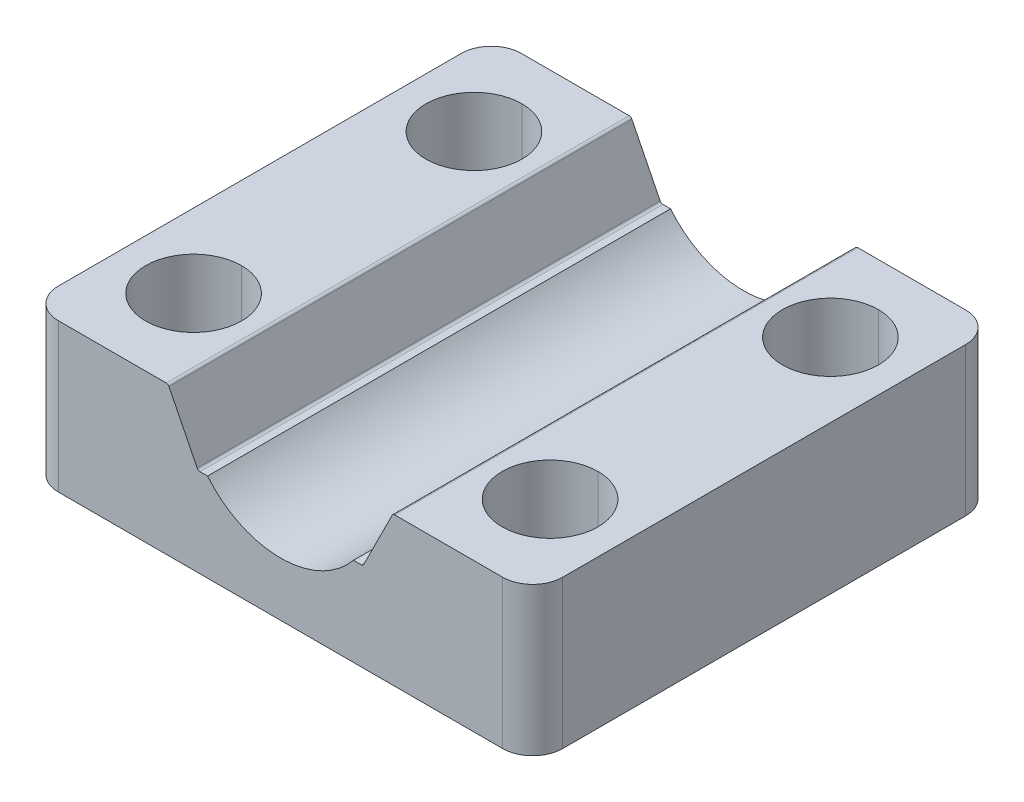
ISO-10303-21;
HEADER;
FILE_DESCRIPTION(('STEP AP214'),'2;1');
FILE_NAME('part.step','',(''),(''),'','','');
FILE_SCHEMA(('AUTOMOTIVE_DESIGN { 1 0 10303 214 1 1 1 1 }'));
ENDSEC;
DATA;
#1=APPLICATION_CONTEXT('core data for automotive mechanical design processes');
#2=APPLICATION_PROTOCOL_DEFINITION('international standard','automotive_design',2000,#1);
#3=PRODUCT_CONTEXT('',#1,'mechanical');
#4=PRODUCT('Part','Part','',(#3));
#5=PRODUCT_RELATED_PRODUCT_CATEGORY('part','',(#4));
#6=PRODUCT_DEFINITION_FORMATION('','',#4);
#7=PRODUCT_DEFINITION_CONTEXT('part definition',#1,'design');
#8=PRODUCT_DEFINITION('design','',#6,#7);
#9=PRODUCT_DEFINITION_SHAPE('','',#8);
#10=(LENGTH_UNIT() NAMED_UNIT(*) SI_UNIT(.MILLI.,.METRE.));
#11=(NAMED_UNIT(*) PLANE_ANGLE_UNIT() SI_UNIT($,.RADIAN.));
#12=(NAMED_UNIT(*) SI_UNIT($,.STERADIAN.) SOLID_ANGLE_UNIT());
#13=UNCERTAINTY_MEASURE_WITH_UNIT(LENGTH_MEASURE(1.E-05),#10,'distance_accuracy_value','');
#14=(GEOMETRIC_REPRESENTATION_CONTEXT(3) GLOBAL_UNCERTAINTY_ASSIGNED_CONTEXT((#13)) GLOBAL_UNIT_ASSIGNED_CONTEXT((#10,
#11,#12)) REPRESENTATION_CONTEXT('',''));
#15=CARTESIAN_POINT('',(0.,0.,0.));
#16=DIRECTION('',(0.,0.,1.));
#17=DIRECTION('',(1.,0.,0.));
#18=AXIS2_PLACEMENT_3D('',#15,#16,#17);
#19=CARTESIAN_POINT('',(-6.985,7.493,-19.6088));
#20=DIRECTION('',(0.,-1.,0.));
#21=DIRECTION('',(0.,0.,-1.));
#22=AXIS2_PLACEMENT_3D('',#19,#20,#21);
#23=PLANE('',#22);
#24=DIRECTION('',(1.,0.,0.));
#25=VECTOR('',#24,1.);
#26=CARTESIAN_POINT('',(-6.985,7.493,-19.6088));
#27=LINE('',#26,#25);
#28=CARTESIAN_POINT('',(6.18009708661603,7.493,-19.6088));
#29=VERTEX_POINT('',#28);
#30=CARTESIAN_POINT('',(6.82801936685753,7.493,-19.6088));
#31=VERTEX_POINT('',#30);
#32=EDGE_CURVE('E41',#29,#31,#27,.T.);
#33=ORIENTED_EDGE('',*,*,#32,.F.);
#34=DIRECTION('',(0.,0.,1.));
#35=VECTOR('',#34,1.);
#36=CARTESIAN_POINT('',(6.18009708661603,7.493,-20.3912));
#37=LINE('',#36,#35);
#38=CARTESIAN_POINT('',(6.18009708661603,7.493,19.6088));
#39=VERTEX_POINT('',#38);
#40=EDGE_CURVE('E11',#29,#39,#37,.T.);
#41=ORIENTED_EDGE('',*,*,#40,.T.);
#42=DIRECTION('',(-1.,0.,0.));
#43=VECTOR('',#42,1.);
#44=CARTESIAN_POINT('',(-21.3614,7.493,19.6088));
#45=LINE('',#44,#43);
#46=CARTESIAN_POINT('',(6.82801936685753,7.493,19.6088));
#47=VERTEX_POINT('',#46);
#48=EDGE_CURVE('E390',#47,#39,#45,.T.);
#49=ORIENTED_EDGE('',*,*,#48,.F.);
#50=DIRECTION('',(0.,0.,-1.));
#51=VECTOR('',#50,1.);
#52=CARTESIAN_POINT('',(6.82801936685753,7.493,-19.6088));
#53=LINE('',#52,#51);
#54=EDGE_CURVE('E27',#47,#31,#53,.T.);
#55=ORIENTED_EDGE('',*,*,#54,.T.);
#56=EDGE_LOOP('',(#33,#41,#49,#55));
#57=FACE_BOUND('',#56,.T.);
#58=ADVANCED_FACE('F16',(#57),#23,.F.);
#59=CARTESIAN_POINT('',(-15.1003,12.573,11.8745));
#60=DIRECTION('',(0.,-1.,0.));
#61=DIRECTION('',(0.,0.,-1.));
#62=AXIS2_PLACEMENT_3D('',#59,#60,#61);
#63=CYLINDRICAL_SURFACE('',#62,4.064);
#64=CARTESIAN_POINT('',(-15.1003,12.573,11.8745));
#65=DIRECTION('',(0.,1.,0.));
#66=DIRECTION('',(0.,0.,1.));
#67=AXIS2_PLACEMENT_3D('',#64,#65,#66);
#68=CIRCLE('',#67,4.064);
#69=CARTESIAN_POINT('',(-15.1003,12.573,7.8105));
#70=VERTEX_POINT('',#69);
#71=CARTESIAN_POINT('',(-15.1003,12.573,15.9385));
#72=VERTEX_POINT('',#71);
#73=EDGE_CURVE('E363',#70,#72,#68,.T.);
#74=ORIENTED_EDGE('',*,*,#73,.T.);
#75=DIRECTION('',(0.,-1.,0.));
#76=VECTOR('',#75,1.);
#77=CARTESIAN_POINT('',(-15.1003,12.573,15.9385));
#78=LINE('',#77,#76);
#79=CARTESIAN_POINT('',(-15.1003,0.,15.9385));
#80=VERTEX_POINT('',#79);
#81=EDGE_CURVE('E332',#72,#80,#78,.T.);
#82=ORIENTED_EDGE('',*,*,#81,.T.);
#83=CARTESIAN_POINT('',(-15.1003,0.,11.8745));
#84=DIRECTION('',(0.,1.,0.));
#85=DIRECTION('',(0.,0.,1.));
#86=AXIS2_PLACEMENT_3D('',#83,#84,#85);
#87=CIRCLE('',#86,4.064);
#88=CARTESIAN_POINT('',(-15.1003,0.,7.8105));
#89=VERTEX_POINT('',#88);
#90=EDGE_CURVE('E439',#89,#80,#87,.T.);
#91=ORIENTED_EDGE('',*,*,#90,.F.);
#92=DIRECTION('',(0.,-1.,0.));
#93=VECTOR('',#92,1.);
#94=CARTESIAN_POINT('',(-15.1003,12.573,7.8105));
#95=LINE('',#94,#93);
#96=EDGE_CURVE('E138',#70,#89,#95,.T.);
#97=ORIENTED_EDGE('',*,*,#96,.F.);
#98=EDGE_LOOP('',(#74,#82,#91,#97));
#99=FACE_BOUND('',#98,.T.);
#100=ADVANCED_FACE('F640',(#99),#63,.F.);
#101=CARTESIAN_POINT('',(15.1003,12.573,-11.8745));
#102=DIRECTION('',(0.,-1.,0.));
#103=DIRECTION('',(0.,0.,-1.));
#104=AXIS2_PLACEMENT_3D('',#101,#102,#103);
#105=CYLINDRICAL_SURFACE('',#104,4.064);
#106=CARTESIAN_POINT('',(15.1003,12.573,-11.8745));
#107=DIRECTION('',(0.,1.,0.));
#108=DIRECTION('',(0.,0.,1.));
#109=AXIS2_PLACEMENT_3D('',#106,#107,#108);
#110=CIRCLE('',#109,4.064);
#111=CARTESIAN_POINT('',(15.1003,12.573,-15.9385));
#112=VERTEX_POINT('',#111);
#113=CARTESIAN_POINT('',(15.1003,12.573,-7.8105));
#114=VERTEX_POINT('',#113);
#115=EDGE_CURVE('E329',#112,#114,#110,.T.);
#116=ORIENTED_EDGE('',*,*,#115,.T.);
#117=DIRECTION('',(0.,-1.,0.));
#118=VECTOR('',#117,1.);
#119=CARTESIAN_POINT('',(15.1003,12.573,-7.8105));
#120=LINE('',#119,#118);
#121=CARTESIAN_POINT('',(15.1003,0.,-7.8105));
#122=VERTEX_POINT('',#121);
#123=EDGE_CURVE('E333',#114,#122,#120,.T.);
#124=ORIENTED_EDGE('',*,*,#123,.T.);
#125=CARTESIAN_POINT('',(15.1003,0.,-11.8745));
#126=DIRECTION('',(0.,1.,0.));
#127=DIRECTION('',(0.,0.,1.));
#128=AXIS2_PLACEMENT_3D('',#125,#126,#127);
#129=CIRCLE('',#128,4.064);
#130=CARTESIAN_POINT('',(15.1003,0.,-15.9385));
#131=VERTEX_POINT('',#130);
#132=EDGE_CURVE('E340',#131,#122,#129,.T.);
#133=ORIENTED_EDGE('',*,*,#132,.F.);
#134=DIRECTION('',(0.,-1.,0.));
#135=VECTOR('',#134,1.);
#136=CARTESIAN_POINT('',(15.1003,12.573,-15.9385));
#137=LINE('',#136,#135);
#138=EDGE_CURVE('E298',#112,#131,#137,.T.);
#139=ORIENTED_EDGE('',*,*,#138,.F.);
#140=EDGE_LOOP('',(#116,#124,#133,#139));
#141=FACE_BOUND('',#140,.T.);
#142=ADVANCED_FACE('F645',(#141),#105,.F.);
#143=CARTESIAN_POINT('',(-15.1003,12.573,-11.8745));
#144=DIRECTION('',(0.,-1.,0.));
#145=DIRECTION('',(0.,0.,-1.));
#146=AXIS2_PLACEMENT_3D('',#143,#144,#145);
#147=CYLINDRICAL_SURFACE('',#146,4.064);
#148=CARTESIAN_POINT('',(-15.1003,12.573,-11.8745));
#149=DIRECTION('',(0.,1.,0.));
#150=DIRECTION('',(0.,0.,1.));
#151=AXIS2_PLACEMENT_3D('',#148,#149,#150);
#152=CIRCLE('',#151,4.064);
#153=CARTESIAN_POINT('',(-15.1003,12.573,-15.9385));
#154=VERTEX_POINT('',#153);
#155=CARTESIAN_POINT('',(-15.1003,12.573,-7.8105));
#156=VERTEX_POINT('',#155);
#157=EDGE_CURVE('E367',#154,#156,#152,.T.);
#158=ORIENTED_EDGE('',*,*,#157,.T.);
#159=DIRECTION('',(0.,-1.,0.));
#160=VECTOR('',#159,1.);
#161=CARTESIAN_POINT('',(-15.1003,12.573,-7.8105));
#162=LINE('',#161,#160);
#163=CARTESIAN_POINT('',(-15.1003,0.,-7.8105));
#164=VERTEX_POINT('',#163);
#165=EDGE_CURVE('E401',#156,#164,#162,.T.);
#166=ORIENTED_EDGE('',*,*,#165,.T.);
#167=CARTESIAN_POINT('',(-15.1003,0.,-11.8745));
#168=DIRECTION('',(0.,1.,0.));
#169=DIRECTION('',(0.,0.,1.));
#170=AXIS2_PLACEMENT_3D('',#167,#168,#169);
#171=CIRCLE('',#170,4.064);
#172=CARTESIAN_POINT('',(-15.1003,0.,-15.9385));
#173=VERTEX_POINT('',#172);
#174=EDGE_CURVE('E339',#173,#164,#171,.T.);
#175=ORIENTED_EDGE('',*,*,#174,.F.);
#176=DIRECTION('',(0.,-1.,0.));
#177=VECTOR('',#176,1.);
#178=CARTESIAN_POINT('',(-15.1003,12.573,-15.9385));
#179=LINE('',#178,#177);
#180=EDGE_CURVE('E319',#154,#173,#179,.T.);
#181=ORIENTED_EDGE('',*,*,#180,.F.);
#182=EDGE_LOOP('',(#158,#166,#175,#181));
#183=FACE_BOUND('',#182,.T.);
#184=ADVANCED_FACE('F549',(#183),#147,.F.);
#185=CARTESIAN_POINT('',(15.1003,12.573,11.8745));
#186=DIRECTION('',(0.,-1.,0.));
#187=DIRECTION('',(0.,0.,-1.));
#188=AXIS2_PLACEMENT_3D('',#185,#186,#187);
#189=CYLINDRICAL_SURFACE('',#188,4.064);
#190=CARTESIAN_POINT('',(15.1003,12.573,11.8745));
#191=DIRECTION('',(0.,1.,0.));
#192=DIRECTION('',(0.,0.,1.));
#193=AXIS2_PLACEMENT_3D('',#190,#191,#192);
#194=CIRCLE('',#193,4.064);
#195=CARTESIAN_POINT('',(15.1003,12.573,7.8105));
#196=VERTEX_POINT('',#195);
#197=CARTESIAN_POINT('',(15.1003,12.573,15.9385));
#198=VERTEX_POINT('',#197);
#199=EDGE_CURVE('E406',#196,#198,#194,.T.);
#200=ORIENTED_EDGE('',*,*,#199,.T.);
#201=DIRECTION('',(0.,-1.,0.));
#202=VECTOR('',#201,1.);
#203=CARTESIAN_POINT('',(15.1003,12.573,15.9385));
#204=LINE('',#203,#202);
#205=CARTESIAN_POINT('',(15.1003,0.,15.9385));
#206=VERTEX_POINT('',#205);
#207=EDGE_CURVE('E402',#198,#206,#204,.T.);
#208=ORIENTED_EDGE('',*,*,#207,.T.);
#209=CARTESIAN_POINT('',(15.1003,0.,11.8745));
#210=DIRECTION('',(0.,1.,0.));
#211=DIRECTION('',(0.,0.,1.));
#212=AXIS2_PLACEMENT_3D('',#209,#210,#211);
#213=CIRCLE('',#212,4.064);
#214=CARTESIAN_POINT('',(15.1003,0.,7.8105));
#215=VERTEX_POINT('',#214);
#216=EDGE_CURVE('E315',#215,#206,#213,.T.);
#217=ORIENTED_EDGE('',*,*,#216,.F.);
#218=DIRECTION('',(0.,-1.,0.));
#219=VECTOR('',#218,1.);
#220=CARTESIAN_POINT('',(15.1003,12.573,7.8105));
#221=LINE('',#220,#219);
#222=EDGE_CURVE('E382',#196,#215,#221,.T.);
#223=ORIENTED_EDGE('',*,*,#222,.F.);
#224=EDGE_LOOP('',(#200,#208,#217,#223));
#225=FACE_BOUND('',#224,.T.);
#226=ADVANCED_FACE('F655',(#225),#189,.F.);
#227=CARTESIAN_POINT('',(0.,12.573,0.));
#228=DIRECTION('',(0.,1.,0.));
#229=DIRECTION('',(1.,0.,0.));
#230=AXIS2_PLACEMENT_3D('',#227,#228,#229);
#231=PLANE('',#230);
#232=DIRECTION('',(0.,0.,-1.));
#233=VECTOR('',#232,1.);
#234=CARTESIAN_POINT('',(21.3614,12.573,-19.6088));
#235=LINE('',#234,#233);
#236=CARTESIAN_POINT('',(21.3614,12.573,17.0688));
#237=VERTEX_POINT('',#236);
#238=CARTESIAN_POINT('',(21.3614,12.573,-17.0688));
#239=VERTEX_POINT('',#238);
#240=EDGE_CURVE('E407',#237,#239,#235,.T.);
#241=ORIENTED_EDGE('',*,*,#240,.T.);
#242=CARTESIAN_POINT('',(18.8214,12.573,-17.0688));
#243=DIRECTION('',(0.,1.,0.));
#244=DIRECTION('',(0.,0.,1.));
#245=AXIS2_PLACEMENT_3D('',#242,#243,#244);
#246=CIRCLE('',#245,2.54);
#247=CARTESIAN_POINT('',(18.8214,12.573,-19.6088));
#248=VERTEX_POINT('',#247);
#249=EDGE_CURVE('E427',#239,#248,#246,.T.);
#250=ORIENTED_EDGE('',*,*,#249,.T.);
#251=DIRECTION('',(-1.,0.,0.));
#252=VECTOR('',#251,1.);
#253=CARTESIAN_POINT('',(-21.3614,12.573,-19.6088));
#254=LINE('',#253,#252);
#255=CARTESIAN_POINT('',(9.68198063314247,12.573,-19.6088));
#256=VERTEX_POINT('',#255);
#257=EDGE_CURVE('E431',#248,#256,#254,.T.);
#258=ORIENTED_EDGE('',*,*,#257,.T.);
#259=DIRECTION('',(0.,0.,1.));
#260=VECTOR('',#259,1.);
#261=CARTESIAN_POINT('',(9.68198063314247,12.573,19.6088));
#262=LINE('',#261,#260);
#263=CARTESIAN_POINT('',(9.68198063314247,12.573,19.6088));
#264=VERTEX_POINT('',#263);
#265=EDGE_CURVE('E307',#256,#264,#262,.T.);
#266=ORIENTED_EDGE('',*,*,#265,.T.);
#267=DIRECTION('',(1.,0.,0.));
#268=VECTOR('',#267,1.);
#269=CARTESIAN_POINT('',(-21.3614,12.573,19.6088));
#270=LINE('',#269,#268);
#271=CARTESIAN_POINT('',(18.8214,12.573,19.6088));
#272=VERTEX_POINT('',#271);
#273=EDGE_CURVE('E303',#264,#272,#270,.T.);
#274=ORIENTED_EDGE('',*,*,#273,.T.);
#275=CARTESIAN_POINT('',(18.8214,12.573,17.0688));
#276=DIRECTION('',(0.,1.,0.));
#277=DIRECTION('',(0.,0.,1.));
#278=AXIS2_PLACEMENT_3D('',#275,#276,#277);
#279=CIRCLE('',#278,2.54);
#280=EDGE_CURVE('E308',#272,#237,#279,.T.);
#281=ORIENTED_EDGE('',*,*,#280,.T.);
#282=EDGE_LOOP('',(#241,#250,#258,#266,#274,#281));
#283=FACE_BOUND('',#282,.T.);
#284=ORIENTED_EDGE('',*,*,#199,.F.);
#285=CARTESIAN_POINT('',(15.1003,12.573,11.8745));
#286=DIRECTION('',(0.,1.,0.));
#287=DIRECTION('',(0.,0.,1.));
#288=AXIS2_PLACEMENT_3D('',#285,#286,#287);
#289=CIRCLE('',#288,4.064);
#290=EDGE_CURVE('E385',#198,#196,#289,.T.);
#291=ORIENTED_EDGE('',*,*,#290,.F.);
#292=EDGE_LOOP('',(#284,#291));
#293=FACE_BOUND('',#292,.T.);
#294=ORIENTED_EDGE('',*,*,#115,.F.);
#295=CARTESIAN_POINT('',(15.1003,12.573,-11.8745));
#296=DIRECTION('',(0.,1.,0.));
#297=DIRECTION('',(0.,0.,1.));
#298=AXIS2_PLACEMENT_3D('',#295,#296,#297);
#299=CIRCLE('',#298,4.064);
#300=EDGE_CURVE('E301',#114,#112,#299,.T.);
#301=ORIENTED_EDGE('',*,*,#300,.F.);
#302=EDGE_LOOP('',(#294,#301));
#303=FACE_BOUND('',#302,.T.);
#304=ADVANCED_FACE('F525',(#283,#293,#303),#231,.T.);
#305=CARTESIAN_POINT('',(0.,12.573,0.));
#306=DIRECTION('',(0.,1.,0.));
#307=DIRECTION('',(1.,0.,0.));
#308=AXIS2_PLACEMENT_3D('',#305,#306,#307);
#309=PLANE('',#308);
#310=DIRECTION('',(-1.,0.,0.));
#311=VECTOR('',#310,1.);
#312=CARTESIAN_POINT('',(-21.3614,12.573,-19.6088));
#313=LINE('',#312,#311);
#314=CARTESIAN_POINT('',(-9.68198063314247,12.573,-19.6088));
#315=VERTEX_POINT('',#314);
#316=CARTESIAN_POINT('',(-18.8214,12.573,-19.6088));
#317=VERTEX_POINT('',#316);
#318=EDGE_CURVE('E370',#315,#317,#313,.T.);
#319=ORIENTED_EDGE('',*,*,#318,.T.);
#320=CARTESIAN_POINT('',(-18.8214,12.573,-17.0688));
#321=DIRECTION('',(0.,1.,0.));
#322=DIRECTION('',(0.,0.,1.));
#323=AXIS2_PLACEMENT_3D('',#320,#321,#322);
#324=CIRCLE('',#323,2.54);
#325=CARTESIAN_POINT('',(-21.3614,12.573,-17.0688));
#326=VERTEX_POINT('',#325);
#327=EDGE_CURVE('E469',#317,#326,#324,.T.);
#328=ORIENTED_EDGE('',*,*,#327,.T.);
#329=DIRECTION('',(0.,0.,1.));
#330=VECTOR('',#329,1.);
#331=CARTESIAN_POINT('',(-21.3614,12.573,-19.6088));
#332=LINE('',#331,#330);
#333=CARTESIAN_POINT('',(-21.3614,12.573,17.0688));
#334=VERTEX_POINT('',#333);
#335=EDGE_CURVE('E356',#326,#334,#332,.T.);
#336=ORIENTED_EDGE('',*,*,#335,.T.);
#337=CARTESIAN_POINT('',(-18.8214,12.573,17.0688));
#338=DIRECTION('',(0.,1.,0.));
#339=DIRECTION('',(0.,0.,1.));
#340=AXIS2_PLACEMENT_3D('',#337,#338,#339);
#341=CIRCLE('',#340,2.54);
#342=CARTESIAN_POINT('',(-18.8214,12.573,19.6088));
#343=VERTEX_POINT('',#342);
#344=EDGE_CURVE('E353',#334,#343,#341,.T.);
#345=ORIENTED_EDGE('',*,*,#344,.T.);
#346=DIRECTION('',(1.,0.,0.));
#347=VECTOR('',#346,1.);
#348=CARTESIAN_POINT('',(-21.3614,12.573,19.6088));
#349=LINE('',#348,#347);
#350=CARTESIAN_POINT('',(-9.68198063314247,12.573,19.6088));
#351=VERTEX_POINT('',#350);
#352=EDGE_CURVE('E268',#343,#351,#349,.T.);
#353=ORIENTED_EDGE('',*,*,#352,.T.);
#354=DIRECTION('',(0.,0.,-1.));
#355=VECTOR('',#354,1.);
#356=CARTESIAN_POINT('',(-9.68198063314247,12.573,-19.6088));
#357=LINE('',#356,#355);
#358=EDGE_CURVE('E309',#351,#315,#357,.T.);
#359=ORIENTED_EDGE('',*,*,#358,.T.);
#360=EDGE_LOOP('',(#319,#328,#336,#345,#353,#359));
#361=FACE_BOUND('',#360,.T.);
#362=ORIENTED_EDGE('',*,*,#157,.F.);
#363=CARTESIAN_POINT('',(-15.1003,12.573,-11.8745));
#364=DIRECTION('',(0.,1.,0.));
#365=DIRECTION('',(0.,0.,1.));
#366=AXIS2_PLACEMENT_3D('',#363,#364,#365);
#367=CIRCLE('',#366,4.064);
#368=EDGE_CURVE('E322',#156,#154,#367,.T.);
#369=ORIENTED_EDGE('',*,*,#368,.F.);
#370=EDGE_LOOP('',(#362,#369));
#371=FACE_BOUND('',#370,.T.);
#372=ORIENTED_EDGE('',*,*,#73,.F.);
#373=CARTESIAN_POINT('',(-15.1003,12.573,11.8745));
#374=DIRECTION('',(0.,1.,0.));
#375=DIRECTION('',(0.,0.,1.));
#376=AXIS2_PLACEMENT_3D('',#373,#374,#375);
#377=CIRCLE('',#376,4.064);
#378=EDGE_CURVE('E302',#72,#70,#377,.T.);
#379=ORIENTED_EDGE('',*,*,#378,.F.);
#380=EDGE_LOOP('',(#372,#379));
#381=FACE_BOUND('',#380,.T.);
#382=ADVANCED_FACE('F556',(#361,#371,#381),#309,.T.);
#383=CARTESIAN_POINT('',(0.,0.,0.));
#384=DIRECTION('',(0.,1.,0.));
#385=DIRECTION('',(1.,0.,0.));
#386=AXIS2_PLACEMENT_3D('',#383,#384,#385);
#387=PLANE('',#386);
#388=DIRECTION('',(-1.,0.,0.));
#389=VECTOR('',#388,1.);
#390=CARTESIAN_POINT('',(-21.3614,0.,-19.6088));
#391=LINE('',#390,#389);
#392=CARTESIAN_POINT('',(18.8214,0.,-19.6088));
#393=VERTEX_POINT('',#392);
#394=CARTESIAN_POINT('',(-18.8214,0.,-19.6088));
#395=VERTEX_POINT('',#394);
#396=EDGE_CURVE('E296',#393,#395,#391,.T.);
#397=ORIENTED_EDGE('',*,*,#396,.F.);
#398=CARTESIAN_POINT('',(18.8214,0.,-17.0688));
#399=DIRECTION('',(0.,-1.,0.));
#400=DIRECTION('',(0.,0.,1.));
#401=AXIS2_PLACEMENT_3D('',#398,#399,#400);
#402=CIRCLE('',#401,2.54);
#403=CARTESIAN_POINT('',(21.3614,0.,-17.0688));
#404=VERTEX_POINT('',#403);
#405=EDGE_CURVE('E312',#393,#404,#402,.T.);
#406=ORIENTED_EDGE('',*,*,#405,.T.);
#407=DIRECTION('',(0.,0.,-1.));
#408=VECTOR('',#407,1.);
#409=CARTESIAN_POINT('',(21.3614,0.,-19.6088));
#410=LINE('',#409,#408);
#411=CARTESIAN_POINT('',(21.3614,0.,17.0688));
#412=VERTEX_POINT('',#411);
#413=EDGE_CURVE('E445',#412,#404,#410,.T.);
#414=ORIENTED_EDGE('',*,*,#413,.F.);
#415=CARTESIAN_POINT('',(18.8214,0.,17.0688));
#416=DIRECTION('',(0.,-1.,0.));
#417=DIRECTION('',(0.,0.,1.));
#418=AXIS2_PLACEMENT_3D('',#415,#416,#417);
#419=CIRCLE('',#418,2.54);
#420=CARTESIAN_POINT('',(18.8214,0.,19.6088));
#421=VERTEX_POINT('',#420);
#422=EDGE_CURVE('E245',#412,#421,#419,.T.);
#423=ORIENTED_EDGE('',*,*,#422,.T.);
#424=DIRECTION('',(1.,0.,0.));
#425=VECTOR('',#424,1.);
#426=CARTESIAN_POINT('',(-21.3614,0.,19.6088));
#427=LINE('',#426,#425);
#428=CARTESIAN_POINT('',(-18.8214,0.,19.6088));
#429=VERTEX_POINT('',#428);
#430=EDGE_CURVE('E237',#429,#421,#427,.T.);
#431=ORIENTED_EDGE('',*,*,#430,.F.);
#432=CARTESIAN_POINT('',(-18.8214,0.,17.0688));
#433=DIRECTION('',(0.,-1.,0.));
#434=DIRECTION('',(0.,0.,1.));
#435=AXIS2_PLACEMENT_3D('',#432,#433,#434);
#436=CIRCLE('',#435,2.54);
#437=CARTESIAN_POINT('',(-21.3614,0.,17.0688));
#438=VERTEX_POINT('',#437);
#439=EDGE_CURVE('E242',#429,#438,#436,.T.);
#440=ORIENTED_EDGE('',*,*,#439,.T.);
#441=DIRECTION('',(0.,0.,1.));
#442=VECTOR('',#441,1.);
#443=CARTESIAN_POINT('',(-21.3614,0.,-19.6088));
#444=LINE('',#443,#442);
#445=CARTESIAN_POINT('',(-21.3614,0.,-17.0688));
#446=VERTEX_POINT('',#445);
#447=EDGE_CURVE('E374',#446,#438,#444,.T.);
#448=ORIENTED_EDGE('',*,*,#447,.F.);
#449=CARTESIAN_POINT('',(-18.8214,0.,-17.0688));
#450=DIRECTION('',(0.,-1.,0.));
#451=DIRECTION('',(0.,0.,1.));
#452=AXIS2_PLACEMENT_3D('',#449,#450,#451);
#453=CIRCLE('',#452,2.54);
#454=EDGE_CURVE('E262',#446,#395,#453,.T.);
#455=ORIENTED_EDGE('',*,*,#454,.T.);
#456=EDGE_LOOP('',(#397,#406,#414,#423,#431,#440,#448,#455));
#457=FACE_BOUND('',#456,.T.);
#458=ORIENTED_EDGE('',*,*,#216,.T.);
#459=CARTESIAN_POINT('',(15.1003,0.,11.8745));
#460=DIRECTION('',(0.,1.,0.));
#461=DIRECTION('',(0.,0.,1.));
#462=AXIS2_PLACEMENT_3D('',#459,#460,#461);
#463=CIRCLE('',#462,4.064);
#464=EDGE_CURVE('E318',#206,#215,#463,.T.);
#465=ORIENTED_EDGE('',*,*,#464,.T.);
#466=EDGE_LOOP('',(#458,#465));
#467=FACE_BOUND('',#466,.T.);
#468=ORIENTED_EDGE('',*,*,#174,.T.);
#469=CARTESIAN_POINT('',(-15.1003,0.,-11.8745));
#470=DIRECTION('',(0.,1.,0.));
#471=DIRECTION('',(0.,0.,1.));
#472=AXIS2_PLACEMENT_3D('',#469,#470,#471);
#473=CIRCLE('',#472,4.064);
#474=EDGE_CURVE('E335',#164,#173,#473,.T.);
#475=ORIENTED_EDGE('',*,*,#474,.T.);
#476=EDGE_LOOP('',(#468,#475));
#477=FACE_BOUND('',#476,.T.);
#478=ORIENTED_EDGE('',*,*,#132,.T.);
#479=CARTESIAN_POINT('',(15.1003,0.,-11.8745));
#480=DIRECTION('',(0.,1.,0.));
#481=DIRECTION('',(0.,0.,1.));
#482=AXIS2_PLACEMENT_3D('',#479,#480,#481);
#483=CIRCLE('',#482,4.064);
#484=EDGE_CURVE('E435',#122,#131,#483,.T.);
#485=ORIENTED_EDGE('',*,*,#484,.T.);
#486=EDGE_LOOP('',(#478,#485));
#487=FACE_BOUND('',#486,.T.);
#488=ORIENTED_EDGE('',*,*,#90,.T.);
#489=CARTESIAN_POINT('',(-15.1003,0.,11.8745));
#490=DIRECTION('',(0.,1.,0.));
#491=DIRECTION('',(0.,0.,1.));
#492=AXIS2_PLACEMENT_3D('',#489,#490,#491);
#493=CIRCLE('',#492,4.064);
#494=EDGE_CURVE('E442',#80,#89,#493,.T.);
#495=ORIENTED_EDGE('',*,*,#494,.T.);
#496=EDGE_LOOP('',(#488,#495));
#497=FACE_BOUND('',#496,.T.);
#498=ADVANCED_FACE('F240',(#457,#467,#477,#487,#497),#387,.F.);
#499=CARTESIAN_POINT('',(21.3614,12.573,-19.6088));
#500=DIRECTION('',(-1.,0.,0.));
#501=DIRECTION('',(0.,1.,0.));
#502=AXIS2_PLACEMENT_3D('',#499,#500,#501);
#503=PLANE('',#502);
#504=ORIENTED_EDGE('',*,*,#413,.T.);
#505=DIRECTION('',(0.,1.,0.));
#506=VECTOR('',#505,1.);
#507=CARTESIAN_POINT('',(21.3614,12.573,-17.0688));
#508=LINE('',#507,#506);
#509=EDGE_CURVE('E327',#404,#239,#508,.T.);
#510=ORIENTED_EDGE('',*,*,#509,.T.);
#511=ORIENTED_EDGE('',*,*,#240,.F.);
#512=DIRECTION('',(0.,-1.,0.));
#513=VECTOR('',#512,1.);
#514=CARTESIAN_POINT('',(21.3614,12.573,17.0688));
#515=LINE('',#514,#513);
#516=EDGE_CURVE('E323',#237,#412,#515,.T.);
#517=ORIENTED_EDGE('',*,*,#516,.T.);
#518=EDGE_LOOP('',(#504,#510,#511,#517));
#519=FACE_BOUND('',#518,.T.);
#520=ADVANCED_FACE('F530',(#519),#503,.F.);
#521=CARTESIAN_POINT('',(-21.3614,12.573,-19.6088));
#522=DIRECTION('',(0.,0.,1.));
#523=DIRECTION('',(1.,0.,0.));
#524=AXIS2_PLACEMENT_3D('',#521,#522,#523);
#525=PLANE('',#524);
#526=DIRECTION('',(1.,0.,0.));
#527=VECTOR('',#526,1.);
#528=CARTESIAN_POINT('',(-6.985,7.493,-19.6088));
#529=LINE('',#528,#527);
#530=CARTESIAN_POINT('',(-6.82801936685753,7.493,-19.6088));
#531=VERTEX_POINT('',#530);
#532=CARTESIAN_POINT('',(-6.18009708661603,7.493,-19.6088));
#533=VERTEX_POINT('',#532);
#534=EDGE_CURVE('E328',#531,#533,#529,.T.);
#535=ORIENTED_EDGE('',*,*,#534,.T.);
#536=CARTESIAN_POINT('',(0.,12.573,-19.6088));
#537=DIRECTION('',(0.,0.,1.));
#538=DIRECTION('',(1.,0.,0.));
#539=AXIS2_PLACEMENT_3D('',#536,#537,#538);
#540=CIRCLE('',#539,8.);
#541=EDGE_CURVE('E344',#533,#29,#540,.T.);
#542=ORIENTED_EDGE('',*,*,#541,.T.);
#543=ORIENTED_EDGE('',*,*,#32,.T.);
#544=CARTESIAN_POINT('',(6.82801936685753,7.747,-19.6088));
#545=DIRECTION('',(0.,0.,1.));
#546=DIRECTION('',(1.,0.,0.));
#547=AXIS2_PLACEMENT_3D('',#544,#545,#546);
#548=CIRCLE('',#547,0.254);
#549=CARTESIAN_POINT('',(7.05520387337151,7.63340774674301,-19.6088));
#550=VERTEX_POINT('',#549);
#551=EDGE_CURVE('E412',#31,#550,#548,.T.);
#552=ORIENTED_EDGE('',*,*,#551,.T.);
#553=DIRECTION('',(0.447213595499958,0.894427190999916,0.));
#554=VECTOR('',#553,1.);
#555=CARTESIAN_POINT('',(6.985,7.493,-19.6088));
#556=LINE('',#555,#554);
#557=CARTESIAN_POINT('',(9.45479612662849,12.432592253257,-19.6088));
#558=VERTEX_POINT('',#557);
#559=EDGE_CURVE('E416',#550,#558,#556,.T.);
#560=ORIENTED_EDGE('',*,*,#559,.T.);
#561=CARTESIAN_POINT('',(9.68198063314247,12.319,-19.6088));
#562=DIRECTION('',(0.,0.,-1.));
#563=DIRECTION('',(1.,0.,0.));
#564=AXIS2_PLACEMENT_3D('',#561,#562,#563);
#565=CIRCLE('',#564,0.254);
#566=EDGE_CURVE('E424',#558,#256,#565,.T.);
#567=ORIENTED_EDGE('',*,*,#566,.T.);
#568=ORIENTED_EDGE('',*,*,#257,.F.);
#569=DIRECTION('',(0.,-1.,0.));
#570=VECTOR('',#569,1.);
#571=CARTESIAN_POINT('',(18.8214,12.573,-19.6088));
#572=LINE('',#571,#570);
#573=EDGE_CURVE('E495',#248,#393,#572,.T.);
#574=ORIENTED_EDGE('',*,*,#573,.T.);
#575=ORIENTED_EDGE('',*,*,#396,.T.);
#576=DIRECTION('',(0.,1.,0.));
#577=VECTOR('',#576,1.);
#578=CARTESIAN_POINT('',(-18.8214,12.573,-19.6088));
#579=LINE('',#578,#577);
#580=EDGE_CURVE('E292',#395,#317,#579,.T.);
#581=ORIENTED_EDGE('',*,*,#580,.T.);
#582=ORIENTED_EDGE('',*,*,#318,.F.);
#583=CARTESIAN_POINT('',(-9.68198063314247,12.319,-19.6088));
#584=DIRECTION('',(0.,0.,-1.));
#585=DIRECTION('',(1.,0.,0.));
#586=AXIS2_PLACEMENT_3D('',#583,#584,#585);
#587=CIRCLE('',#586,0.254);
#588=CARTESIAN_POINT('',(-9.4547961266285,12.432592253257,-19.6088));
#589=VERTEX_POINT('',#588);
#590=EDGE_CURVE('E297',#315,#589,#587,.T.);
#591=ORIENTED_EDGE('',*,*,#590,.T.);
#592=DIRECTION('',(0.447213595499958,-0.894427190999916,0.));
#593=VECTOR('',#592,1.);
#594=CARTESIAN_POINT('',(-9.525,12.573,-19.6088));
#595=LINE('',#594,#593);
#596=CARTESIAN_POINT('',(-7.05520387337151,7.63340774674301,-19.6088));
#597=VERTEX_POINT('',#596);
#598=EDGE_CURVE('E351',#589,#597,#595,.T.);
#599=ORIENTED_EDGE('',*,*,#598,.T.);
#600=CARTESIAN_POINT('',(-6.82801936685753,7.747,-19.6088));
#601=DIRECTION('',(0.,0.,1.));
#602=DIRECTION('',(1.,0.,0.));
#603=AXIS2_PLACEMENT_3D('',#600,#601,#602);
#604=CIRCLE('',#603,0.254);
#605=EDGE_CURVE('E348',#597,#531,#604,.T.);
#606=ORIENTED_EDGE('',*,*,#605,.T.);
#607=EDGE_LOOP('',(#535,#542,#543,#552,#560,#567,#568,#574,#575,#581,#582,#591,#599,#606));
#608=FACE_BOUND('',#607,.T.);
#609=ADVANCED_FACE('F593',(#608),#525,.F.);
#610=CARTESIAN_POINT('',(-21.3614,12.573,-19.6088));
#611=DIRECTION('',(1.,0.,0.));
#612=DIRECTION('',(0.,0.,-1.));
#613=AXIS2_PLACEMENT_3D('',#610,#611,#612);
#614=PLANE('',#613);
#615=ORIENTED_EDGE('',*,*,#335,.F.);
#616=DIRECTION('',(0.,-1.,0.));
#617=VECTOR('',#616,1.);
#618=CARTESIAN_POINT('',(-21.3614,12.573,-17.0688));
#619=LINE('',#618,#617);
#620=EDGE_CURVE('E352',#326,#446,#619,.T.);
#621=ORIENTED_EDGE('',*,*,#620,.T.);
#622=ORIENTED_EDGE('',*,*,#447,.T.);
#623=DIRECTION('',(0.,1.,0.));
#624=VECTOR('',#623,1.);
#625=CARTESIAN_POINT('',(-21.3614,12.573,17.0688));
#626=LINE('',#625,#624);
#627=EDGE_CURVE('E260',#438,#334,#626,.T.);
#628=ORIENTED_EDGE('',*,*,#627,.T.);
#629=EDGE_LOOP('',(#615,#621,#622,#628));
#630=FACE_BOUND('',#629,.T.);
#631=ADVANCED_FACE('F700',(#630),#614,.F.);
#632=CARTESIAN_POINT('',(-21.3614,12.573,19.6088));
#633=DIRECTION('',(0.,0.,-1.));
#634=DIRECTION('',(0.,-1.,0.));
#635=AXIS2_PLACEMENT_3D('',#632,#633,#634);
#636=PLANE('',#635);
#637=ORIENTED_EDGE('',*,*,#48,.T.);
#638=CARTESIAN_POINT('',(0.,12.573,19.6088));
#639=DIRECTION('',(0.,0.,1.));
#640=DIRECTION('',(1.,0.,0.));
#641=AXIS2_PLACEMENT_3D('',#638,#639,#640);
#642=CIRCLE('',#641,8.);
#643=CARTESIAN_POINT('',(-6.18009708661603,7.493,19.6088));
#644=VERTEX_POINT('',#643);
#645=EDGE_CURVE('E375',#644,#39,#642,.T.);
#646=ORIENTED_EDGE('',*,*,#645,.F.);
#647=DIRECTION('',(-1.,0.,0.));
#648=VECTOR('',#647,1.);
#649=CARTESIAN_POINT('',(-21.3614,7.493,19.6088));
#650=LINE('',#649,#648);
#651=CARTESIAN_POINT('',(-6.82801936685753,7.493,19.6088));
#652=VERTEX_POINT('',#651);
#653=EDGE_CURVE('E393',#644,#652,#650,.T.);
#654=ORIENTED_EDGE('',*,*,#653,.T.);
#655=CARTESIAN_POINT('',(-6.82801936685753,7.747,19.6088));
#656=DIRECTION('',(0.,0.,-1.));
#657=DIRECTION('',(-1.,0.,0.));
#658=AXIS2_PLACEMENT_3D('',#655,#656,#657);
#659=CIRCLE('',#658,0.254);
#660=CARTESIAN_POINT('',(-7.05520387337151,7.63340774674301,19.6088));
#661=VERTEX_POINT('',#660);
#662=EDGE_CURVE('E397',#652,#661,#659,.T.);
#663=ORIENTED_EDGE('',*,*,#662,.T.);
#664=DIRECTION('',(-0.447213595499958,0.894427190999916,0.));
#665=VECTOR('',#664,1.);
#666=CARTESIAN_POINT('',(-11.89228,17.30756,19.6088));
#667=LINE('',#666,#665);
#668=CARTESIAN_POINT('',(-9.45479612662849,12.432592253257,19.6088));
#669=VERTEX_POINT('',#668);
#670=EDGE_CURVE('E277',#661,#669,#667,.T.);
#671=ORIENTED_EDGE('',*,*,#670,.T.);
#672=CARTESIAN_POINT('',(-9.68198063314247,12.319,19.6088));
#673=DIRECTION('',(0.,0.,1.));
#674=DIRECTION('',(-1.,0.,0.));
#675=AXIS2_PLACEMENT_3D('',#672,#673,#674);
#676=CIRCLE('',#675,0.254);
#677=EDGE_CURVE('E271',#669,#351,#676,.T.);
#678=ORIENTED_EDGE('',*,*,#677,.T.);
#679=ORIENTED_EDGE('',*,*,#352,.F.);
#680=DIRECTION('',(0.,-1.,0.));
#681=VECTOR('',#680,1.);
#682=CARTESIAN_POINT('',(-18.8214,12.573,19.6088));
#683=LINE('',#682,#681);
#684=EDGE_CURVE('E251',#343,#429,#683,.T.);
#685=ORIENTED_EDGE('',*,*,#684,.T.);
#686=ORIENTED_EDGE('',*,*,#430,.T.);
#687=DIRECTION('',(0.,1.,0.));
#688=VECTOR('',#687,1.);
#689=CARTESIAN_POINT('',(18.8214,12.573,19.6088));
#690=LINE('',#689,#688);
#691=EDGE_CURVE('E252',#421,#272,#690,.T.);
#692=ORIENTED_EDGE('',*,*,#691,.T.);
#693=ORIENTED_EDGE('',*,*,#273,.F.);
#694=CARTESIAN_POINT('',(9.68198063314247,12.319,19.6088));
#695=DIRECTION('',(0.,0.,1.));
#696=DIRECTION('',(-1.,0.,0.));
#697=AXIS2_PLACEMENT_3D('',#694,#695,#696);
#698=CIRCLE('',#697,0.254);
#699=CARTESIAN_POINT('',(9.4547961266285,12.432592253257,19.6088));
#700=VERTEX_POINT('',#699);
#701=EDGE_CURVE('E20',#264,#700,#698,.T.);
#702=ORIENTED_EDGE('',*,*,#701,.T.);
#703=DIRECTION('',(-0.447213595499958,-0.894427190999916,0.));
#704=VECTOR('',#703,1.);
#705=CARTESIAN_POINT('',(3.34772,0.21844,19.6088));
#706=LINE('',#705,#704);
#707=CARTESIAN_POINT('',(7.05520387337151,7.63340774674301,19.6088));
#708=VERTEX_POINT('',#707);
#709=EDGE_CURVE('E473',#700,#708,#706,.T.);
#710=ORIENTED_EDGE('',*,*,#709,.T.);
#711=CARTESIAN_POINT('',(6.82801936685753,7.747,19.6088));
#712=DIRECTION('',(0.,0.,-1.));
#713=DIRECTION('',(-1.,0.,0.));
#714=AXIS2_PLACEMENT_3D('',#711,#712,#713);
#715=CIRCLE('',#714,0.254);
#716=EDGE_CURVE('E411',#708,#47,#715,.T.);
#717=ORIENTED_EDGE('',*,*,#716,.T.);
#718=EDGE_LOOP('',(#637,#646,#654,#663,#671,#678,#679,#685,#686,#692,#693,#702,#710,#717));
#719=FACE_BOUND('',#718,.T.);
#720=ADVANCED_FACE('F265',(#719),#636,.F.);
#721=CARTESIAN_POINT('',(15.1003,12.573,11.8745));
#722=DIRECTION('',(0.,-1.,0.));
#723=DIRECTION('',(0.,0.,-1.));
#724=AXIS2_PLACEMENT_3D('',#721,#722,#723);
#725=CYLINDRICAL_SURFACE('',#724,4.064);
#726=ORIENTED_EDGE('',*,*,#207,.F.);
#727=ORIENTED_EDGE('',*,*,#290,.T.);
#728=ORIENTED_EDGE('',*,*,#222,.T.);
#729=ORIENTED_EDGE('',*,*,#464,.F.);
#730=EDGE_LOOP('',(#726,#727,#728,#729));
#731=FACE_BOUND('',#730,.T.);
#732=ADVANCED_FACE('F696',(#731),#725,.F.);
#733=CARTESIAN_POINT('',(-15.1003,12.573,-11.8745));
#734=DIRECTION('',(0.,-1.,0.));
#735=DIRECTION('',(0.,0.,-1.));
#736=AXIS2_PLACEMENT_3D('',#733,#734,#735);
#737=CYLINDRICAL_SURFACE('',#736,4.064);
#738=ORIENTED_EDGE('',*,*,#165,.F.);
#739=ORIENTED_EDGE('',*,*,#368,.T.);
#740=ORIENTED_EDGE('',*,*,#180,.T.);
#741=ORIENTED_EDGE('',*,*,#474,.F.);
#742=EDGE_LOOP('',(#738,#739,#740,#741));
#743=FACE_BOUND('',#742,.T.);
#744=ADVANCED_FACE('F554',(#743),#737,.F.);
#745=CARTESIAN_POINT('',(15.1003,12.573,-11.8745));
#746=DIRECTION('',(0.,-1.,0.));
#747=DIRECTION('',(0.,0.,-1.));
#748=AXIS2_PLACEMENT_3D('',#745,#746,#747);
#749=CYLINDRICAL_SURFACE('',#748,4.064);
#750=ORIENTED_EDGE('',*,*,#123,.F.);
#751=ORIENTED_EDGE('',*,*,#300,.T.);
#752=ORIENTED_EDGE('',*,*,#138,.T.);
#753=ORIENTED_EDGE('',*,*,#484,.F.);
#754=EDGE_LOOP('',(#750,#751,#752,#753));
#755=FACE_BOUND('',#754,.T.);
#756=ADVANCED_FACE('F648',(#755),#749,.F.);
#757=CARTESIAN_POINT('',(-15.1003,12.573,11.8745));
#758=DIRECTION('',(0.,-1.,0.));
#759=DIRECTION('',(0.,0.,-1.));
#760=AXIS2_PLACEMENT_3D('',#757,#758,#759);
#761=CYLINDRICAL_SURFACE('',#760,4.064);
#762=ORIENTED_EDGE('',*,*,#81,.F.);
#763=ORIENTED_EDGE('',*,*,#378,.T.);
#764=ORIENTED_EDGE('',*,*,#96,.T.);
#765=ORIENTED_EDGE('',*,*,#494,.F.);
#766=EDGE_LOOP('',(#762,#763,#764,#765));
#767=FACE_BOUND('',#766,.T.);
#768=ADVANCED_FACE('F684',(#767),#761,.F.);
#769=CARTESIAN_POINT('',(6.985,7.493,-19.6088));
#770=DIRECTION('',(0.894427190999916,-0.447213595499958,0.));
#771=DIRECTION('',(0.,0.,-1.));
#772=AXIS2_PLACEMENT_3D('',#769,#770,#771);
#773=PLANE('',#772);
#774=ORIENTED_EDGE('',*,*,#559,.F.);
#775=DIRECTION('',(0.,0.,1.));
#776=VECTOR('',#775,1.);
#777=CARTESIAN_POINT('',(7.05520387337151,7.63340774674301,19.6088));
#778=LINE('',#777,#776);
#779=EDGE_CURVE('E291',#550,#708,#778,.T.);
#780=ORIENTED_EDGE('',*,*,#779,.T.);
#781=ORIENTED_EDGE('',*,*,#709,.F.);
#782=DIRECTION('',(0.,0.,-1.));
#783=VECTOR('',#782,1.);
#784=CARTESIAN_POINT('',(9.45479612662849,12.432592253257,-19.6088));
#785=LINE('',#784,#783);
#786=EDGE_CURVE('E286',#700,#558,#785,.T.);
#787=ORIENTED_EDGE('',*,*,#786,.T.);
#788=EDGE_LOOP('',(#774,#780,#781,#787));
#789=FACE_BOUND('',#788,.T.);
#790=ADVANCED_FACE('F617',(#789),#773,.F.);
#791=CARTESIAN_POINT('',(-6.985,7.493,-19.6088));
#792=DIRECTION('',(0.,-1.,0.));
#793=DIRECTION('',(0.,0.,-1.));
#794=AXIS2_PLACEMENT_3D('',#791,#792,#793);
#795=PLANE('',#794);
#796=ORIENTED_EDGE('',*,*,#653,.F.);
#797=DIRECTION('',(0.,0.,-1.));
#798=VECTOR('',#797,1.);
#799=CARTESIAN_POINT('',(-6.18009708661603,7.493,-20.3912));
#800=LINE('',#799,#798);
#801=EDGE_CURVE('E282',#644,#533,#800,.T.);
#802=ORIENTED_EDGE('',*,*,#801,.T.);
#803=ORIENTED_EDGE('',*,*,#534,.F.);
#804=DIRECTION('',(0.,0.,1.));
#805=VECTOR('',#804,1.);
#806=CARTESIAN_POINT('',(-6.82801936685753,7.493,19.6088));
#807=LINE('',#806,#805);
#808=EDGE_CURVE('E287',#531,#652,#807,.T.);
#809=ORIENTED_EDGE('',*,*,#808,.T.);
#810=EDGE_LOOP('',(#796,#802,#803,#809));
#811=FACE_BOUND('',#810,.T.);
#812=ADVANCED_FACE('F672',(#811),#795,.F.);
#813=CARTESIAN_POINT('',(-9.525,12.573,-19.6088));
#814=DIRECTION('',(-0.894427190999916,-0.447213595499958,0.));
#815=DIRECTION('',(-0.447213595499958,0.894427190999916,0.));
#816=AXIS2_PLACEMENT_3D('',#813,#814,#815);
#817=PLANE('',#816);
#818=ORIENTED_EDGE('',*,*,#670,.F.);
#819=DIRECTION('',(0.,0.,-1.));
#820=VECTOR('',#819,1.);
#821=CARTESIAN_POINT('',(-7.05520387337151,7.63340774674301,-19.6088));
#822=LINE('',#821,#820);
#823=EDGE_CURVE('E389',#661,#597,#822,.T.);
#824=ORIENTED_EDGE('',*,*,#823,.T.);
#825=ORIENTED_EDGE('',*,*,#598,.F.);
#826=DIRECTION('',(0.,0.,1.));
#827=VECTOR('',#826,1.);
#828=CARTESIAN_POINT('',(-9.4547961266285,12.432592253257,19.6088));
#829=LINE('',#828,#827);
#830=EDGE_CURVE('E379',#589,#669,#829,.T.);
#831=ORIENTED_EDGE('',*,*,#830,.T.);
#832=EDGE_LOOP('',(#818,#824,#825,#831));
#833=FACE_BOUND('',#832,.T.);
#834=ADVANCED_FACE('F581',(#833),#817,.F.);
#835=CARTESIAN_POINT('',(6.82801936685753,7.747,-19.6088));
#836=DIRECTION('',(0.,0.,-1.));
#837=DIRECTION('',(-1.,0.,0.));
#838=AXIS2_PLACEMENT_3D('',#835,#836,#837);
#839=CYLINDRICAL_SURFACE('',#838,0.254);
#840=ORIENTED_EDGE('',*,*,#551,.F.);
#841=ORIENTED_EDGE('',*,*,#54,.F.);
#842=ORIENTED_EDGE('',*,*,#716,.F.);
#843=ORIENTED_EDGE('',*,*,#779,.F.);
#844=EDGE_LOOP('',(#840,#841,#842,#843));
#845=FACE_BOUND('',#844,.T.);
#846=ADVANCED_FACE('F615',(#845),#839,.F.);
#847=CARTESIAN_POINT('',(9.68198063314247,12.319,0.));
#848=DIRECTION('',(0.,0.,-1.));
#849=DIRECTION('',(-1.,0.,0.));
#850=AXIS2_PLACEMENT_3D('',#847,#848,#849);
#851=CYLINDRICAL_SURFACE('',#850,0.254);
#852=ORIENTED_EDGE('',*,*,#566,.F.);
#853=ORIENTED_EDGE('',*,*,#786,.F.);
#854=ORIENTED_EDGE('',*,*,#701,.F.);
#855=ORIENTED_EDGE('',*,*,#265,.F.);
#856=EDGE_LOOP('',(#852,#853,#854,#855));
#857=FACE_BOUND('',#856,.T.);
#858=ADVANCED_FACE('F621',(#857),#851,.T.);
#859=CARTESIAN_POINT('',(-6.82801936685753,7.747,-19.6088));
#860=DIRECTION('',(0.,0.,-1.));
#861=DIRECTION('',(-1.,0.,0.));
#862=AXIS2_PLACEMENT_3D('',#859,#860,#861);
#863=CYLINDRICAL_SURFACE('',#862,0.254);
#864=ORIENTED_EDGE('',*,*,#605,.F.);
#865=ORIENTED_EDGE('',*,*,#823,.F.);
#866=ORIENTED_EDGE('',*,*,#662,.F.);
#867=ORIENTED_EDGE('',*,*,#808,.F.);
#868=EDGE_LOOP('',(#864,#865,#866,#867));
#869=FACE_BOUND('',#868,.T.);
#870=ADVANCED_FACE('F18',(#869),#863,.F.);
#871=CARTESIAN_POINT('',(-9.68198063314247,12.319,-19.6088));
#872=DIRECTION('',(0.,0.,-1.));
#873=DIRECTION('',(-1.,0.,0.));
#874=AXIS2_PLACEMENT_3D('',#871,#872,#873);
#875=CYLINDRICAL_SURFACE('',#874,0.254);
#876=ORIENTED_EDGE('',*,*,#590,.F.);
#877=ORIENTED_EDGE('',*,*,#358,.F.);
#878=ORIENTED_EDGE('',*,*,#677,.F.);
#879=ORIENTED_EDGE('',*,*,#830,.F.);
#880=EDGE_LOOP('',(#876,#877,#878,#879));
#881=FACE_BOUND('',#880,.T.);
#882=ADVANCED_FACE('F584',(#881),#875,.T.);
#883=CARTESIAN_POINT('',(18.8214,12.573,-17.0688));
#884=DIRECTION('',(0.,-1.,0.));
#885=DIRECTION('',(0.,0.,-1.));
#886=AXIS2_PLACEMENT_3D('',#883,#884,#885);
#887=CYLINDRICAL_SURFACE('',#886,2.54);
#888=ORIENTED_EDGE('',*,*,#249,.F.);
#889=ORIENTED_EDGE('',*,*,#509,.F.);
#890=ORIENTED_EDGE('',*,*,#405,.F.);
#891=ORIENTED_EDGE('',*,*,#573,.F.);
#892=EDGE_LOOP('',(#888,#889,#890,#891));
#893=FACE_BOUND('',#892,.T.);
#894=ADVANCED_FACE('F533',(#893),#887,.T.);
#895=CARTESIAN_POINT('',(-18.8214,12.573,-17.0688));
#896=DIRECTION('',(0.,-1.,0.));
#897=DIRECTION('',(0.,0.,-1.));
#898=AXIS2_PLACEMENT_3D('',#895,#896,#897);
#899=CYLINDRICAL_SURFACE('',#898,2.54);
#900=ORIENTED_EDGE('',*,*,#327,.F.);
#901=ORIENTED_EDGE('',*,*,#580,.F.);
#902=ORIENTED_EDGE('',*,*,#454,.F.);
#903=ORIENTED_EDGE('',*,*,#620,.F.);
#904=EDGE_LOOP('',(#900,#901,#902,#903));
#905=FACE_BOUND('',#904,.T.);
#906=ADVANCED_FACE('F626',(#905),#899,.T.);
#907=CARTESIAN_POINT('',(18.8214,12.573,17.0688));
#908=DIRECTION('',(0.,-1.,0.));
#909=DIRECTION('',(0.,0.,-1.));
#910=AXIS2_PLACEMENT_3D('',#907,#908,#909);
#911=CYLINDRICAL_SURFACE('',#910,2.54);
#912=ORIENTED_EDGE('',*,*,#280,.F.);
#913=ORIENTED_EDGE('',*,*,#691,.F.);
#914=ORIENTED_EDGE('',*,*,#422,.F.);
#915=ORIENTED_EDGE('',*,*,#516,.F.);
#916=EDGE_LOOP('',(#912,#913,#914,#915));
#917=FACE_BOUND('',#916,.T.);
#918=ADVANCED_FACE('F624',(#917),#911,.T.);
#919=CARTESIAN_POINT('',(-18.8214,12.573,17.0688));
#920=DIRECTION('',(0.,-1.,0.));
#921=DIRECTION('',(0.,0.,-1.));
#922=AXIS2_PLACEMENT_3D('',#919,#920,#921);
#923=CYLINDRICAL_SURFACE('',#922,2.54);
#924=ORIENTED_EDGE('',*,*,#344,.F.);
#925=ORIENTED_EDGE('',*,*,#627,.F.);
#926=ORIENTED_EDGE('',*,*,#439,.F.);
#927=ORIENTED_EDGE('',*,*,#684,.F.);
#928=EDGE_LOOP('',(#924,#925,#926,#927));
#929=FACE_BOUND('',#928,.T.);
#930=ADVANCED_FACE('F257',(#929),#923,.T.);
#931=CARTESIAN_POINT('',(0.,12.573,-20.3912));
#932=DIRECTION('',(0.,0.,1.));
#933=DIRECTION('',(1.,0.,0.));
#934=AXIS2_PLACEMENT_3D('',#931,#932,#933);
#935=CYLINDRICAL_SURFACE('',#934,8.);
#936=ORIENTED_EDGE('',*,*,#541,.F.);
#937=ORIENTED_EDGE('',*,*,#801,.F.);
#938=ORIENTED_EDGE('',*,*,#645,.T.);
#939=ORIENTED_EDGE('',*,*,#40,.F.);
#940=EDGE_LOOP('',(#936,#937,#938,#939));
#941=FACE_BOUND('',#940,.T.);
#942=ADVANCED_FACE('F633',(#941),#935,.F.);
#943=CLOSED_SHELL('',(#58,#100,#142,#184,#226,#304,#382,#498,#520,#609,#631,#720,#732,#744,#756,
#768,#790,#812,#834,#846,#858,#870,#882,#894,#906,#918,#930,#942));
#944=MANIFOLD_SOLID_BREP('B1',#943);
#945=ADVANCED_BREP_SHAPE_REPRESENTATION('',(#18,#944),#14);
#946=SHAPE_DEFINITION_REPRESENTATION(#9,#945);
ENDSEC;
END-ISO-10303-21;
